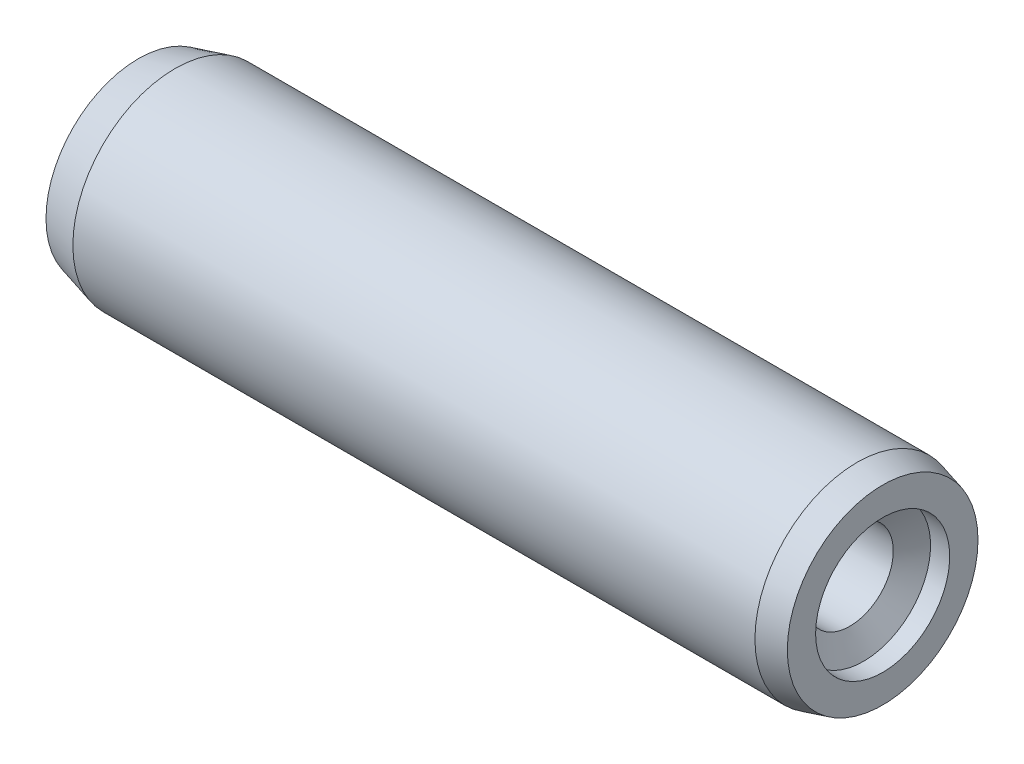
ISO-10303-21;
HEADER;
FILE_DESCRIPTION(('STEP AP214'),'2;1');
FILE_NAME('part.step','',(''),(''),'','','');
FILE_SCHEMA(('AUTOMOTIVE_DESIGN { 1 0 10303 214 1 1 1 1 }'));
ENDSEC;
DATA;
#1=APPLICATION_CONTEXT('core data for automotive mechanical design processes');
#2=APPLICATION_PROTOCOL_DEFINITION('international standard','automotive_design',2000,#1);
#3=PRODUCT_CONTEXT('',#1,'mechanical');
#4=PRODUCT('Part','Part','',(#3));
#5=PRODUCT_RELATED_PRODUCT_CATEGORY('part','',(#4));
#6=PRODUCT_DEFINITION_FORMATION('','',#4);
#7=PRODUCT_DEFINITION_CONTEXT('part definition',#1,'design');
#8=PRODUCT_DEFINITION('design','',#6,#7);
#9=PRODUCT_DEFINITION_SHAPE('','',#8);
#10=(LENGTH_UNIT() NAMED_UNIT(*) SI_UNIT(.MILLI.,.METRE.));
#11=(NAMED_UNIT(*) PLANE_ANGLE_UNIT() SI_UNIT($,.RADIAN.));
#12=(NAMED_UNIT(*) SI_UNIT($,.STERADIAN.) SOLID_ANGLE_UNIT());
#13=UNCERTAINTY_MEASURE_WITH_UNIT(LENGTH_MEASURE(1.E-05),#10,'distance_accuracy_value','');
#14=(GEOMETRIC_REPRESENTATION_CONTEXT(3) GLOBAL_UNCERTAINTY_ASSIGNED_CONTEXT((#13)) GLOBAL_UNIT_ASSIGNED_CONTEXT((#10,
#11,#12)) REPRESENTATION_CONTEXT('',''));
#15=CARTESIAN_POINT('',(0.,0.,0.));
#16=DIRECTION('',(0.,0.,1.));
#17=DIRECTION('',(1.,0.,0.));
#18=AXIS2_PLACEMENT_3D('',#15,#16,#17);
#19=CARTESIAN_POINT('',(60.,7.46410161513776,0.));
#20=DIRECTION('',(-1.,0.,0.));
#21=DIRECTION('',(0.,0.,1.));
#22=AXIS2_PLACEMENT_3D('',#19,#20,#21);
#23=PLANE('',#22);
#24=CARTESIAN_POINT('',(60.,0.,0.));
#25=DIRECTION('',(-1.,0.,0.));
#26=DIRECTION('',(0.,0.,1.));
#27=AXIS2_PLACEMENT_3D('',#24,#25,#26);
#28=CIRCLE('',#27,7.46410161513776);
#29=CARTESIAN_POINT('',(60.,0.,7.46410161513776));
#30=VERTEX_POINT('',#29);
#31=EDGE_CURVE('E11',#30,#30,#28,.T.);
#32=ORIENTED_EDGE('',*,*,#31,.F.);
#33=EDGE_LOOP('',(#32));
#34=FACE_BOUND('',#33,.T.);
#35=CARTESIAN_POINT('',(60.,0.,0.));
#36=DIRECTION('',(-1.,0.,0.));
#37=DIRECTION('',(0.,0.,1.));
#38=AXIS2_PLACEMENT_3D('',#35,#36,#37);
#39=CIRCLE('',#38,5.25);
#40=CARTESIAN_POINT('',(60.,0.,5.25));
#41=VERTEX_POINT('',#40);
#42=EDGE_CURVE('E72',#41,#41,#39,.T.);
#43=ORIENTED_EDGE('',*,*,#42,.T.);
#44=EDGE_LOOP('',(#43));
#45=FACE_BOUND('',#44,.T.);
#46=ADVANCED_FACE('F34',(#34,#45),#23,.F.);
#47=CARTESIAN_POINT('',(60.,0.,0.));
#48=DIRECTION('',(-1.,0.,0.));
#49=DIRECTION('',(0.,0.,1.));
#50=AXIS2_PLACEMENT_3D('',#47,#48,#49);
#51=CONICAL_SURFACE('',#50,7.46410161513776,0.261799387799146);
#52=CARTESIAN_POINT('',(58.,0.,0.));
#53=DIRECTION('',(-1.,0.,0.));
#54=DIRECTION('',(0.,0.,1.));
#55=AXIS2_PLACEMENT_3D('',#52,#53,#54);
#56=CIRCLE('',#55,8.);
#57=CARTESIAN_POINT('',(58.,0.,8.));
#58=VERTEX_POINT('',#57);
#59=EDGE_CURVE('E40',#58,#58,#56,.T.);
#60=ORIENTED_EDGE('',*,*,#59,.F.);
#61=EDGE_LOOP('',(#60));
#62=FACE_BOUND('',#61,.T.);
#63=ORIENTED_EDGE('',*,*,#31,.T.);
#64=EDGE_LOOP('',(#63));
#65=FACE_BOUND('',#64,.T.);
#66=ADVANCED_FACE('F61',(#62,#65),#51,.T.);
#67=CARTESIAN_POINT('',(0.,0.,0.));
#68=DIRECTION('',(-1.,0.,0.));
#69=DIRECTION('',(0.,0.,1.));
#70=AXIS2_PLACEMENT_3D('',#67,#68,#69);
#71=CYLINDRICAL_SURFACE('',#70,8.);
#72=CARTESIAN_POINT('',(4.6,0.,0.));
#73=DIRECTION('',(-1.,0.,0.));
#74=DIRECTION('',(0.,0.,1.));
#75=AXIS2_PLACEMENT_3D('',#72,#73,#74);
#76=CIRCLE('',#75,8.);
#77=CARTESIAN_POINT('',(4.6,0.,8.));
#78=VERTEX_POINT('',#77);
#79=EDGE_CURVE('E88',#78,#78,#76,.T.);
#80=ORIENTED_EDGE('',*,*,#79,.F.);
#81=EDGE_LOOP('',(#80));
#82=FACE_BOUND('',#81,.T.);
#83=ORIENTED_EDGE('',*,*,#59,.T.);
#84=EDGE_LOOP('',(#83));
#85=FACE_BOUND('',#84,.T.);
#86=ADVANCED_FACE('F66',(#82,#85),#71,.T.);
#87=CARTESIAN_POINT('',(4.6,0.,0.));
#88=DIRECTION('',(1.,0.,0.));
#89=DIRECTION('',(0.,0.,-1.));
#90=AXIS2_PLACEMENT_3D('',#87,#88,#89);
#91=CONICAL_SURFACE('',#90,8.,0.261799387799143);
#92=CARTESIAN_POINT('',(1.72675925051775,0.,0.));
#93=DIRECTION('',(-1.,0.,0.));
#94=DIRECTION('',(0.,0.,1.));
#95=AXIS2_PLACEMENT_3D('',#92,#93,#94);
#96=CIRCLE('',#95,7.23011746151606);
#97=CARTESIAN_POINT('',(1.72675925051775,0.,7.23011746151606));
#98=VERTEX_POINT('',#97);
#99=EDGE_CURVE('E85',#98,#98,#96,.T.);
#100=ORIENTED_EDGE('',*,*,#99,.F.);
#101=EDGE_LOOP('',(#100));
#102=FACE_BOUND('',#101,.T.);
#103=ORIENTED_EDGE('',*,*,#79,.T.);
#104=EDGE_LOOP('',(#103));
#105=FACE_BOUND('',#104,.T.);
#106=ADVANCED_FACE('F56',(#102,#105),#91,.T.);
#107=CARTESIAN_POINT('',(16.,0.,0.));
#108=DIRECTION('',(-1.,0.,0.));
#109=DIRECTION('',(0.,1.,0.));
#110=AXIS2_PLACEMENT_3D('',#107,#108,#109);
#111=SPHERICAL_SURFACE('',#110,16.);
#112=ORIENTED_EDGE('',*,*,#99,.T.);
#113=EDGE_LOOP('',(#112));
#114=FACE_BOUND('',#113,.T.);
#115=ADVANCED_FACE('F46',(#114),#111,.T.);
#116=CARTESIAN_POINT('',(33.5916738879315,0.,0.));
#117=DIRECTION('',(1.,0.,0.));
#118=DIRECTION('',(0.,0.,-1.));
#119=AXIS2_PLACEMENT_3D('',#116,#117,#118);
#120=CONICAL_SURFACE('',#119,0.,1.17809724509617);
#121=CARTESIAN_POINT('',(35.,0.,0.));
#122=DIRECTION('',(-1.,0.,0.));
#123=DIRECTION('',(0.,0.,1.));
#124=AXIS2_PLACEMENT_3D('',#121,#122,#123);
#125=CIRCLE('',#124,3.4);
#126=CARTESIAN_POINT('',(35.,0.,3.4));
#127=VERTEX_POINT('',#126);
#128=EDGE_CURVE('E82',#127,#127,#125,.T.);
#129=ORIENTED_EDGE('',*,*,#128,.F.);
#130=EDGE_LOOP('',(#129));
#131=FACE_BOUND('',#130,.T.);
#132=CARTESIAN_POINT('',(33.5916738879315,0.,0.));
#133=VERTEX_POINT('',#132);
#134=VERTEX_LOOP('',#133);
#135=FACE_BOUND('',#134,.T.);
#136=ADVANCED_FACE('F43',(#131,#135),#120,.F.);
#137=CARTESIAN_POINT('',(0.,0.,0.));
#138=DIRECTION('',(-1.,0.,0.));
#139=DIRECTION('',(0.,0.,1.));
#140=AXIS2_PLACEMENT_3D('',#137,#138,#139);
#141=CYLINDRICAL_SURFACE('',#140,3.4);
#142=CARTESIAN_POINT('',(57.4319020019992,0.,0.));
#143=DIRECTION('',(-1.,0.,0.));
#144=DIRECTION('',(0.,0.,1.));
#145=AXIS2_PLACEMENT_3D('',#142,#143,#144);
#146=CIRCLE('',#145,3.4);
#147=CARTESIAN_POINT('',(57.4319020019992,0.,3.4));
#148=VERTEX_POINT('',#147);
#149=EDGE_CURVE('E77',#148,#148,#146,.T.);
#150=ORIENTED_EDGE('',*,*,#149,.F.);
#151=EDGE_LOOP('',(#150));
#152=FACE_BOUND('',#151,.T.);
#153=ORIENTED_EDGE('',*,*,#128,.T.);
#154=EDGE_LOOP('',(#153));
#155=FACE_BOUND('',#154,.T.);
#156=ADVANCED_FACE('F45',(#152,#155),#141,.F.);
#157=CARTESIAN_POINT('',(57.4319020019992,0.,0.));
#158=DIRECTION('',(1.,0.,0.));
#159=DIRECTION('',(0.,0.,-1.));
#160=AXIS2_PLACEMENT_3D('',#157,#158,#159);
#161=CONICAL_SURFACE('',#160,3.4,1.0471975511966);
#162=CARTESIAN_POINT('',(58.5,0.,0.));
#163=DIRECTION('',(-1.,0.,0.));
#164=DIRECTION('',(0.,0.,1.));
#165=AXIS2_PLACEMENT_3D('',#162,#163,#164);
#166=CIRCLE('',#165,5.25);
#167=CARTESIAN_POINT('',(58.5,0.,5.25));
#168=VERTEX_POINT('',#167);
#169=EDGE_CURVE('E74',#168,#168,#166,.T.);
#170=ORIENTED_EDGE('',*,*,#169,.F.);
#171=EDGE_LOOP('',(#170));
#172=FACE_BOUND('',#171,.T.);
#173=ORIENTED_EDGE('',*,*,#149,.T.);
#174=EDGE_LOOP('',(#173));
#175=FACE_BOUND('',#174,.T.);
#176=ADVANCED_FACE('F53',(#172,#175),#161,.F.);
#177=CARTESIAN_POINT('',(0.,0.,0.));
#178=DIRECTION('',(-1.,0.,0.));
#179=DIRECTION('',(0.,0.,1.));
#180=AXIS2_PLACEMENT_3D('',#177,#178,#179);
#181=CYLINDRICAL_SURFACE('',#180,5.25);
#182=ORIENTED_EDGE('',*,*,#42,.F.);
#183=EDGE_LOOP('',(#182));
#184=FACE_BOUND('',#183,.T.);
#185=ORIENTED_EDGE('',*,*,#169,.T.);
#186=EDGE_LOOP('',(#185));
#187=FACE_BOUND('',#186,.T.);
#188=ADVANCED_FACE('F131',(#184,#187),#181,.F.);
#189=CLOSED_SHELL('',(#46,#66,#86,#106,#115,#136,#156,#176,#188));
#190=MANIFOLD_SOLID_BREP('B2',#189);
#191=ADVANCED_BREP_SHAPE_REPRESENTATION('',(#18,#190),#14);
#192=SHAPE_DEFINITION_REPRESENTATION(#9,#191);
ENDSEC;
END-ISO-10303-21;
